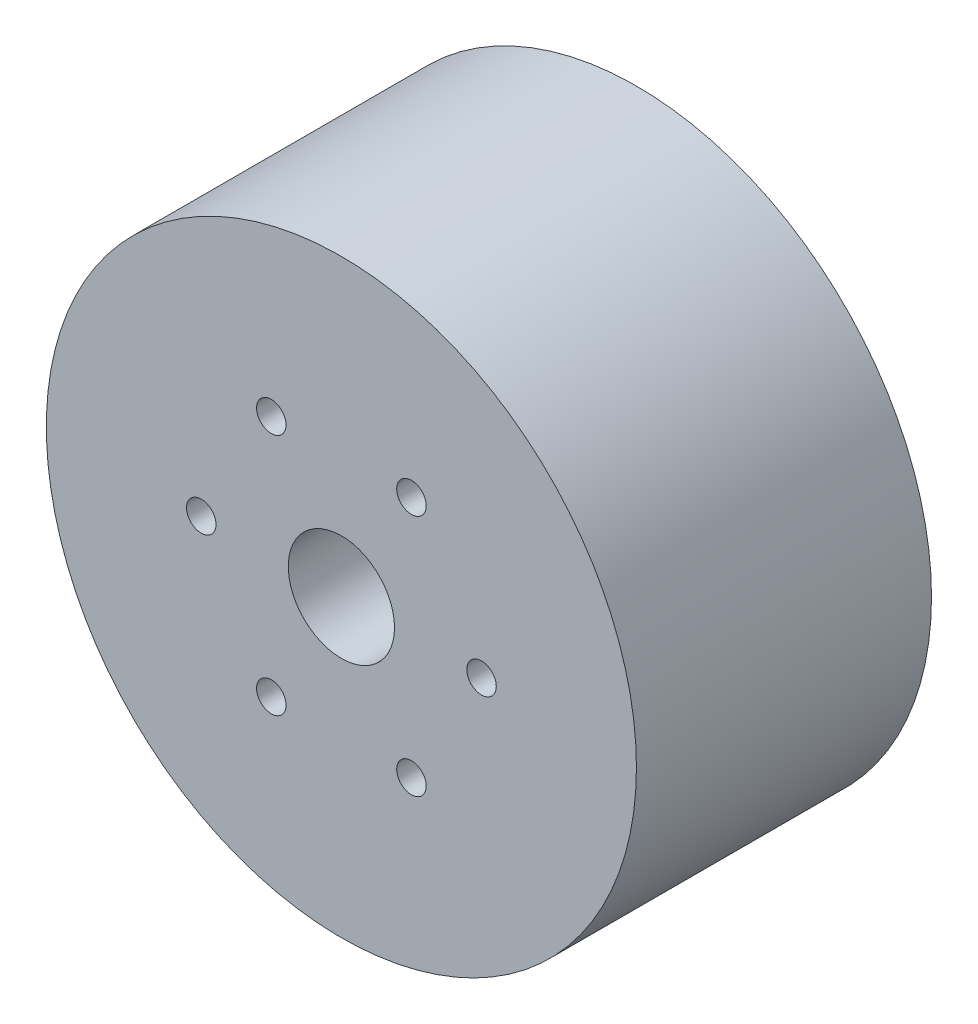
ISO-10303-21;
HEADER;
FILE_DESCRIPTION(('STEP AP214'),'2;1');
FILE_NAME('part.step','',(''),(''),'','','');
FILE_SCHEMA(('AUTOMOTIVE_DESIGN { 1 0 10303 214 1 1 1 1 }'));
ENDSEC;
DATA;
#1=APPLICATION_CONTEXT('core data for automotive mechanical design processes');
#2=APPLICATION_PROTOCOL_DEFINITION('international standard','automotive_design',2000,#1);
#3=PRODUCT_CONTEXT('',#1,'mechanical');
#4=PRODUCT('Part','Part','',(#3));
#5=PRODUCT_RELATED_PRODUCT_CATEGORY('part','',(#4));
#6=PRODUCT_DEFINITION_FORMATION('','',#4);
#7=PRODUCT_DEFINITION_CONTEXT('part definition',#1,'design');
#8=PRODUCT_DEFINITION('design','',#6,#7);
#9=PRODUCT_DEFINITION_SHAPE('','',#8);
#10=(LENGTH_UNIT() NAMED_UNIT(*) SI_UNIT(.MILLI.,.METRE.));
#11=(NAMED_UNIT(*) PLANE_ANGLE_UNIT() SI_UNIT($,.RADIAN.));
#12=(NAMED_UNIT(*) SI_UNIT($,.STERADIAN.) SOLID_ANGLE_UNIT());
#13=UNCERTAINTY_MEASURE_WITH_UNIT(LENGTH_MEASURE(1.E-05),#10,'distance_accuracy_value','');
#14=(GEOMETRIC_REPRESENTATION_CONTEXT(3) GLOBAL_UNCERTAINTY_ASSIGNED_CONTEXT((#13)) GLOBAL_UNIT_ASSIGNED_CONTEXT((#10,
#11,#12)) REPRESENTATION_CONTEXT('',''));
#15=CARTESIAN_POINT('',(0.,0.,0.));
#16=DIRECTION('',(0.,0.,1.));
#17=DIRECTION('',(1.,0.,0.));
#18=AXIS2_PLACEMENT_3D('',#15,#16,#17);
#19=CARTESIAN_POINT('',(0.,0.,50.));
#20=DIRECTION('',(0.,0.,1.));
#21=DIRECTION('',(1.,0.,0.));
#22=AXIS2_PLACEMENT_3D('',#19,#20,#21);
#23=PLANE('',#22);
#24=CARTESIAN_POINT('',(11.8750000000002,20.5681033398803,50.));
#25=DIRECTION('',(0.,0.,1.));
#26=DIRECTION('',(1.,0.,0.));
#27=AXIS2_PLACEMENT_3D('',#24,#25,#26);
#28=CIRCLE('',#27,2.5);
#29=CARTESIAN_POINT('',(14.3750000000002,20.5681033398803,50.));
#30=VERTEX_POINT('',#29);
#31=EDGE_CURVE('E57',#30,#30,#28,.T.);
#32=ORIENTED_EDGE('',*,*,#31,.F.);
#33=EDGE_LOOP('',(#32));
#34=FACE_BOUND('',#33,.T.);
#35=CARTESIAN_POINT('',(-11.8749999999998,20.5681033398805,50.));
#36=DIRECTION('',(0.,0.,1.));
#37=DIRECTION('',(1.,0.,0.));
#38=AXIS2_PLACEMENT_3D('',#35,#36,#37);
#39=CIRCLE('',#38,2.5);
#40=CARTESIAN_POINT('',(-9.37499999999981,20.5681033398805,50.));
#41=VERTEX_POINT('',#40);
#42=EDGE_CURVE('E60',#41,#41,#39,.T.);
#43=ORIENTED_EDGE('',*,*,#42,.F.);
#44=EDGE_LOOP('',(#43));
#45=FACE_BOUND('',#44,.T.);
#46=CARTESIAN_POINT('',(-23.75,0.,50.));
#47=DIRECTION('',(0.,0.,1.));
#48=DIRECTION('',(1.,0.,0.));
#49=AXIS2_PLACEMENT_3D('',#46,#47,#48);
#50=CIRCLE('',#49,2.5);
#51=CARTESIAN_POINT('',(-21.25,0.,50.));
#52=VERTEX_POINT('',#51);
#53=EDGE_CURVE('E63',#52,#52,#50,.T.);
#54=ORIENTED_EDGE('',*,*,#53,.F.);
#55=EDGE_LOOP('',(#54));
#56=FACE_BOUND('',#55,.T.);
#57=CARTESIAN_POINT('',(-11.8750000000001,-20.5681033398804,50.));
#58=DIRECTION('',(0.,0.,1.));
#59=DIRECTION('',(1.,0.,0.));
#60=AXIS2_PLACEMENT_3D('',#57,#58,#59);
#61=CIRCLE('',#60,2.5);
#62=CARTESIAN_POINT('',(-9.3750000000001,-20.5681033398804,50.));
#63=VERTEX_POINT('',#62);
#64=EDGE_CURVE('E66',#63,#63,#61,.T.);
#65=ORIENTED_EDGE('',*,*,#64,.F.);
#66=EDGE_LOOP('',(#65));
#67=FACE_BOUND('',#66,.T.);
#68=CARTESIAN_POINT('',(11.875,-20.5681033398804,50.));
#69=DIRECTION('',(0.,0.,1.));
#70=DIRECTION('',(1.,0.,0.));
#71=AXIS2_PLACEMENT_3D('',#68,#69,#70);
#72=CIRCLE('',#71,2.5);
#73=CARTESIAN_POINT('',(14.375,-20.5681033398804,50.));
#74=VERTEX_POINT('',#73);
#75=EDGE_CURVE('E69',#74,#74,#72,.T.);
#76=ORIENTED_EDGE('',*,*,#75,.F.);
#77=EDGE_LOOP('',(#76));
#78=FACE_BOUND('',#77,.T.);
#79=CARTESIAN_POINT('',(23.75,0.,50.));
#80=DIRECTION('',(0.,0.,1.));
#81=DIRECTION('',(1.,0.,0.));
#82=AXIS2_PLACEMENT_3D('',#79,#80,#81);
#83=CIRCLE('',#82,2.5);
#84=CARTESIAN_POINT('',(26.25,0.,50.));
#85=VERTEX_POINT('',#84);
#86=EDGE_CURVE('E49',#85,#85,#83,.T.);
#87=ORIENTED_EDGE('',*,*,#86,.F.);
#88=EDGE_LOOP('',(#87));
#89=FACE_BOUND('',#88,.T.);
#90=CARTESIAN_POINT('',(0.,0.,50.));
#91=DIRECTION('',(0.,0.,1.));
#92=DIRECTION('',(1.,0.,0.));
#93=AXIS2_PLACEMENT_3D('',#90,#91,#92);
#94=CIRCLE('',#93,50.);
#95=CARTESIAN_POINT('',(50.,0.,50.));
#96=VERTEX_POINT('',#95);
#97=EDGE_CURVE('E10',#96,#96,#94,.T.);
#98=ORIENTED_EDGE('',*,*,#97,.T.);
#99=EDGE_LOOP('',(#98));
#100=FACE_BOUND('',#99,.T.);
#101=CARTESIAN_POINT('',(0.,0.,50.));
#102=DIRECTION('',(0.,0.,1.));
#103=DIRECTION('',(1.,0.,0.));
#104=AXIS2_PLACEMENT_3D('',#101,#102,#103);
#105=CIRCLE('',#104,9.);
#106=CARTESIAN_POINT('',(9.,0.,50.));
#107=VERTEX_POINT('',#106);
#108=EDGE_CURVE('E44',#107,#107,#105,.T.);
#109=ORIENTED_EDGE('',*,*,#108,.F.);
#110=EDGE_LOOP('',(#109));
#111=FACE_BOUND('',#110,.T.);
#112=ADVANCED_FACE('F33',(#34,#45,#56,#67,#78,#89,#100,#111),#23,.T.);
#113=CARTESIAN_POINT('',(0.,0.,0.));
#114=DIRECTION('',(0.,0.,1.));
#115=DIRECTION('',(1.,0.,0.));
#116=AXIS2_PLACEMENT_3D('',#113,#114,#115);
#117=PLANE('',#116);
#118=CARTESIAN_POINT('',(11.8750000000002,20.5681033398803,0.));
#119=DIRECTION('',(0.,0.,1.));
#120=DIRECTION('',(0.50000000000001,0.866025403784433,0.));
#121=AXIS2_PLACEMENT_3D('',#118,#119,#120);
#122=CIRCLE('',#121,2.5);
#123=CARTESIAN_POINT('',(13.1250000000003,22.7331668493414,0.));
#124=VERTEX_POINT('',#123);
#125=EDGE_CURVE('E76',#124,#124,#122,.T.);
#126=ORIENTED_EDGE('',*,*,#125,.T.);
#127=EDGE_LOOP('',(#126));
#128=FACE_BOUND('',#127,.T.);
#129=CARTESIAN_POINT('',(-11.8749999999998,20.5681033398805,0.));
#130=DIRECTION('',(0.,0.,1.));
#131=DIRECTION('',(-0.499999999999992,0.866025403784443,0.));
#132=AXIS2_PLACEMENT_3D('',#129,#130,#131);
#133=CIRCLE('',#132,2.5);
#134=CARTESIAN_POINT('',(-13.1249999999998,22.7331668493416,0.));
#135=VERTEX_POINT('',#134);
#136=EDGE_CURVE('E79',#135,#135,#133,.T.);
#137=ORIENTED_EDGE('',*,*,#136,.T.);
#138=EDGE_LOOP('',(#137));
#139=FACE_BOUND('',#138,.T.);
#140=CARTESIAN_POINT('',(-23.75,0.,0.));
#141=DIRECTION('',(0.,0.,1.));
#142=DIRECTION('',(-1.,0.,0.));
#143=AXIS2_PLACEMENT_3D('',#140,#141,#142);
#144=CIRCLE('',#143,2.5);
#145=CARTESIAN_POINT('',(-26.25,0.,0.));
#146=VERTEX_POINT('',#145);
#147=EDGE_CURVE('E82',#146,#146,#144,.T.);
#148=ORIENTED_EDGE('',*,*,#147,.T.);
#149=EDGE_LOOP('',(#148));
#150=FACE_BOUND('',#149,.T.);
#151=CARTESIAN_POINT('',(-11.8750000000001,-20.5681033398804,0.));
#152=DIRECTION('',(0.,0.,1.));
#153=DIRECTION('',(-0.500000000000004,-0.866025403784436,0.));
#154=AXIS2_PLACEMENT_3D('',#151,#152,#153);
#155=CIRCLE('',#154,2.5);
#156=CARTESIAN_POINT('',(-13.1250000000001,-22.7331668493415,0.));
#157=VERTEX_POINT('',#156);
#158=EDGE_CURVE('E75',#157,#157,#155,.T.);
#159=ORIENTED_EDGE('',*,*,#158,.T.);
#160=EDGE_LOOP('',(#159));
#161=FACE_BOUND('',#160,.T.);
#162=CARTESIAN_POINT('',(11.875,-20.5681033398804,0.));
#163=DIRECTION('',(0.,0.,1.));
#164=DIRECTION('',(0.499999999999998,-0.86602540378444,0.));
#165=AXIS2_PLACEMENT_3D('',#162,#163,#164);
#166=CIRCLE('',#165,2.5);
#167=CARTESIAN_POINT('',(13.1249999999999,-22.7331668493415,0.));
#168=VERTEX_POINT('',#167);
#169=EDGE_CURVE('E72',#168,#168,#166,.T.);
#170=ORIENTED_EDGE('',*,*,#169,.T.);
#171=EDGE_LOOP('',(#170));
#172=FACE_BOUND('',#171,.T.);
#173=CARTESIAN_POINT('',(23.75,0.,0.));
#174=DIRECTION('',(0.,0.,1.));
#175=DIRECTION('',(1.,0.,0.));
#176=AXIS2_PLACEMENT_3D('',#173,#174,#175);
#177=CIRCLE('',#176,2.5);
#178=CARTESIAN_POINT('',(26.25,0.,0.));
#179=VERTEX_POINT('',#178);
#180=EDGE_CURVE('E54',#179,#179,#177,.T.);
#181=ORIENTED_EDGE('',*,*,#180,.T.);
#182=EDGE_LOOP('',(#181));
#183=FACE_BOUND('',#182,.T.);
#184=CARTESIAN_POINT('',(0.,0.,0.));
#185=DIRECTION('',(0.,0.,1.));
#186=DIRECTION('',(1.,0.,0.));
#187=AXIS2_PLACEMENT_3D('',#184,#185,#186);
#188=CIRCLE('',#187,50.);
#189=CARTESIAN_POINT('',(50.,0.,0.));
#190=VERTEX_POINT('',#189);
#191=EDGE_CURVE('E37',#190,#190,#188,.T.);
#192=ORIENTED_EDGE('',*,*,#191,.F.);
#193=EDGE_LOOP('',(#192));
#194=FACE_BOUND('',#193,.T.);
#195=CARTESIAN_POINT('',(0.,0.,0.));
#196=DIRECTION('',(0.,0.,1.));
#197=DIRECTION('',(1.,0.,0.));
#198=AXIS2_PLACEMENT_3D('',#195,#196,#197);
#199=CIRCLE('',#198,9.);
#200=CARTESIAN_POINT('',(9.,0.,0.));
#201=VERTEX_POINT('',#200);
#202=EDGE_CURVE('E46',#201,#201,#199,.T.);
#203=ORIENTED_EDGE('',*,*,#202,.T.);
#204=EDGE_LOOP('',(#203));
#205=FACE_BOUND('',#204,.T.);
#206=ADVANCED_FACE('F88',(#128,#139,#150,#161,#172,#183,#194,#205),#117,.F.);
#207=CARTESIAN_POINT('',(0.,0.,50.));
#208=DIRECTION('',(0.,0.,-1.));
#209=DIRECTION('',(-1.,0.,0.));
#210=AXIS2_PLACEMENT_3D('',#207,#208,#209);
#211=CYLINDRICAL_SURFACE('',#210,50.);
#212=ORIENTED_EDGE('',*,*,#97,.F.);
#213=EDGE_LOOP('',(#212));
#214=FACE_BOUND('',#213,.T.);
#215=ORIENTED_EDGE('',*,*,#191,.T.);
#216=EDGE_LOOP('',(#215));
#217=FACE_BOUND('',#216,.T.);
#218=ADVANCED_FACE('F35',(#214,#217),#211,.T.);
#219=CARTESIAN_POINT('',(0.,0.,50.));
#220=DIRECTION('',(0.,0.,-1.));
#221=DIRECTION('',(-1.,0.,0.));
#222=AXIS2_PLACEMENT_3D('',#219,#220,#221);
#223=CYLINDRICAL_SURFACE('',#222,9.);
#224=ORIENTED_EDGE('',*,*,#108,.T.);
#225=EDGE_LOOP('',(#224));
#226=FACE_BOUND('',#225,.T.);
#227=ORIENTED_EDGE('',*,*,#202,.F.);
#228=EDGE_LOOP('',(#227));
#229=FACE_BOUND('',#228,.T.);
#230=ADVANCED_FACE('F117',(#226,#229),#223,.F.);
#231=CARTESIAN_POINT('',(23.75,0.,0.));
#232=DIRECTION('',(0.,0.,1.));
#233=DIRECTION('',(1.,0.,0.));
#234=AXIS2_PLACEMENT_3D('',#231,#232,#233);
#235=CYLINDRICAL_SURFACE('',#234,2.5);
#236=ORIENTED_EDGE('',*,*,#86,.T.);
#237=EDGE_LOOP('',(#236));
#238=FACE_BOUND('',#237,.T.);
#239=ORIENTED_EDGE('',*,*,#180,.F.);
#240=EDGE_LOOP('',(#239));
#241=FACE_BOUND('',#240,.T.);
#242=ADVANCED_FACE('F104',(#238,#241),#235,.F.);
#243=CARTESIAN_POINT('',(11.875,-20.5681033398804,0.));
#244=DIRECTION('',(0.,0.,1.));
#245=DIRECTION('',(1.,0.,0.));
#246=AXIS2_PLACEMENT_3D('',#243,#244,#245);
#247=CYLINDRICAL_SURFACE('',#246,2.5);
#248=ORIENTED_EDGE('',*,*,#75,.T.);
#249=EDGE_LOOP('',(#248));
#250=FACE_BOUND('',#249,.T.);
#251=ORIENTED_EDGE('',*,*,#169,.F.);
#252=EDGE_LOOP('',(#251));
#253=FACE_BOUND('',#252,.T.);
#254=ADVANCED_FACE('F94',(#250,#253),#247,.F.);
#255=CARTESIAN_POINT('',(-11.8750000000001,-20.5681033398804,0.));
#256=DIRECTION('',(0.,0.,1.));
#257=DIRECTION('',(1.,0.,0.));
#258=AXIS2_PLACEMENT_3D('',#255,#256,#257);
#259=CYLINDRICAL_SURFACE('',#258,2.5);
#260=ORIENTED_EDGE('',*,*,#64,.T.);
#261=EDGE_LOOP('',(#260));
#262=FACE_BOUND('',#261,.T.);
#263=ORIENTED_EDGE('',*,*,#158,.F.);
#264=EDGE_LOOP('',(#263));
#265=FACE_BOUND('',#264,.T.);
#266=ADVANCED_FACE('F91',(#262,#265),#259,.F.);
#267=CARTESIAN_POINT('',(-23.75,0.,0.));
#268=DIRECTION('',(0.,0.,1.));
#269=DIRECTION('',(1.,0.,0.));
#270=AXIS2_PLACEMENT_3D('',#267,#268,#269);
#271=CYLINDRICAL_SURFACE('',#270,2.5);
#272=ORIENTED_EDGE('',*,*,#53,.T.);
#273=EDGE_LOOP('',(#272));
#274=FACE_BOUND('',#273,.T.);
#275=ORIENTED_EDGE('',*,*,#147,.F.);
#276=EDGE_LOOP('',(#275));
#277=FACE_BOUND('',#276,.T.);
#278=ADVANCED_FACE('F93',(#274,#277),#271,.F.);
#279=CARTESIAN_POINT('',(-11.8749999999998,20.5681033398805,0.));
#280=DIRECTION('',(0.,0.,1.));
#281=DIRECTION('',(1.,0.,0.));
#282=AXIS2_PLACEMENT_3D('',#279,#280,#281);
#283=CYLINDRICAL_SURFACE('',#282,2.5);
#284=ORIENTED_EDGE('',*,*,#42,.T.);
#285=EDGE_LOOP('',(#284));
#286=FACE_BOUND('',#285,.T.);
#287=ORIENTED_EDGE('',*,*,#136,.F.);
#288=EDGE_LOOP('',(#287));
#289=FACE_BOUND('',#288,.T.);
#290=ADVANCED_FACE('F101',(#286,#289),#283,.F.);
#291=CARTESIAN_POINT('',(11.8750000000002,20.5681033398803,0.));
#292=DIRECTION('',(0.,0.,1.));
#293=DIRECTION('',(1.,0.,0.));
#294=AXIS2_PLACEMENT_3D('',#291,#292,#293);
#295=CYLINDRICAL_SURFACE('',#294,2.5);
#296=ORIENTED_EDGE('',*,*,#31,.T.);
#297=EDGE_LOOP('',(#296));
#298=FACE_BOUND('',#297,.T.);
#299=ORIENTED_EDGE('',*,*,#125,.F.);
#300=EDGE_LOOP('',(#299));
#301=FACE_BOUND('',#300,.T.);
#302=ADVANCED_FACE('F124',(#298,#301),#295,.F.);
#303=CLOSED_SHELL('',(#112,#206,#218,#230,#242,#254,#266,#278,#290,#302));
#304=MANIFOLD_SOLID_BREP('B2',#303);
#305=ADVANCED_BREP_SHAPE_REPRESENTATION('',(#18,#304),#14);
#306=SHAPE_DEFINITION_REPRESENTATION(#9,#305);
ENDSEC;
END-ISO-10303-21;
